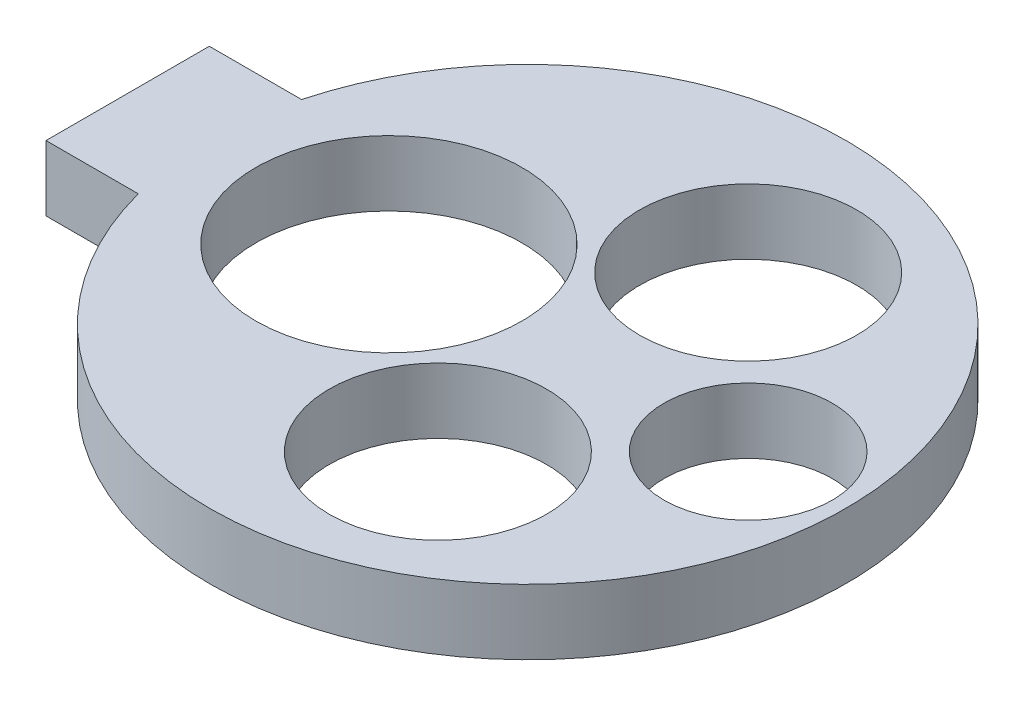
ISO-10303-21;
HEADER;
FILE_DESCRIPTION(('STEP AP214'),'2;1');
FILE_NAME('part.step','',(''),(''),'','','');
FILE_SCHEMA(('AUTOMOTIVE_DESIGN { 1 0 10303 214 1 1 1 1 }'));
ENDSEC;
DATA;
#1=APPLICATION_CONTEXT('core data for automotive mechanical design processes');
#2=APPLICATION_PROTOCOL_DEFINITION('international standard','automotive_design',2000,#1);
#3=PRODUCT_CONTEXT('',#1,'mechanical');
#4=PRODUCT('Part','Part','',(#3));
#5=PRODUCT_RELATED_PRODUCT_CATEGORY('part','',(#4));
#6=PRODUCT_DEFINITION_FORMATION('','',#4);
#7=PRODUCT_DEFINITION_CONTEXT('part definition',#1,'design');
#8=PRODUCT_DEFINITION('design','',#6,#7);
#9=PRODUCT_DEFINITION_SHAPE('','',#8);
#10=(LENGTH_UNIT() NAMED_UNIT(*) SI_UNIT(.MILLI.,.METRE.));
#11=(NAMED_UNIT(*) PLANE_ANGLE_UNIT() SI_UNIT($,.RADIAN.));
#12=(NAMED_UNIT(*) SI_UNIT($,.STERADIAN.) SOLID_ANGLE_UNIT());
#13=UNCERTAINTY_MEASURE_WITH_UNIT(LENGTH_MEASURE(1.E-05),#10,'distance_accuracy_value','');
#14=(GEOMETRIC_REPRESENTATION_CONTEXT(3) GLOBAL_UNCERTAINTY_ASSIGNED_CONTEXT((#13)) GLOBAL_UNIT_ASSIGNED_CONTEXT((#10,
#11,#12)) REPRESENTATION_CONTEXT('',''));
#15=CARTESIAN_POINT('',(0.,0.,0.));
#16=DIRECTION('',(0.,0.,1.));
#17=DIRECTION('',(1.,0.,0.));
#18=AXIS2_PLACEMENT_3D('',#15,#16,#17);
#19=CARTESIAN_POINT('',(0.,2.,0.));
#20=DIRECTION('',(0.,-1.,0.));
#21=DIRECTION('',(0.,0.,-1.));
#22=AXIS2_PLACEMENT_3D('',#19,#20,#21);
#23=CYLINDRICAL_SURFACE('',#22,19.5);
#24=DIRECTION('',(0.,-1.,0.));
#25=VECTOR('',#24,1.);
#26=CARTESIAN_POINT('',(-18.8480768249708,2.,5.));
#27=LINE('',#26,#25);
#28=CARTESIAN_POINT('',(-18.8480768249708,-2.,5.));
#29=VERTEX_POINT('',#28);
#30=CARTESIAN_POINT('',(-18.8480768249708,2.,5.));
#31=VERTEX_POINT('',#30);
#32=EDGE_CURVE('E11',#29,#31,#27,.F.);
#33=ORIENTED_EDGE('',*,*,#32,.F.);
#34=CARTESIAN_POINT('',(0.,-2.,0.));
#35=DIRECTION('',(0.,1.,0.));
#36=DIRECTION('',(0.,0.,1.));
#37=AXIS2_PLACEMENT_3D('',#34,#35,#36);
#38=CIRCLE('',#37,19.5);
#39=CARTESIAN_POINT('',(-18.8480768249708,-2.,-5.));
#40=VERTEX_POINT('',#39);
#41=EDGE_CURVE('E47',#29,#40,#38,.T.);
#42=ORIENTED_EDGE('',*,*,#41,.T.);
#43=DIRECTION('',(0.,-1.,0.));
#44=VECTOR('',#43,1.);
#45=CARTESIAN_POINT('',(-18.8480768249708,2.,-5.));
#46=LINE('',#45,#44);
#47=CARTESIAN_POINT('',(-18.8480768249708,2.,-5.));
#48=VERTEX_POINT('',#47);
#49=EDGE_CURVE('E40',#48,#40,#46,.T.);
#50=ORIENTED_EDGE('',*,*,#49,.F.);
#51=CARTESIAN_POINT('',(0.,2.,0.));
#52=DIRECTION('',(0.,1.,0.));
#53=DIRECTION('',(0.,0.,1.));
#54=AXIS2_PLACEMENT_3D('',#51,#52,#53);
#55=CIRCLE('',#54,19.5);
#56=EDGE_CURVE('E52',#31,#48,#55,.T.);
#57=ORIENTED_EDGE('',*,*,#56,.F.);
#58=EDGE_LOOP('',(#33,#42,#50,#57));
#59=FACE_BOUND('',#58,.T.);
#60=ADVANCED_FACE('F33',(#59),#23,.T.);
#61=CARTESIAN_POINT('',(0.,2.,0.));
#62=DIRECTION('',(0.,1.,0.));
#63=DIRECTION('',(0.,0.,1.));
#64=AXIS2_PLACEMENT_3D('',#61,#62,#63);
#65=PLANE('',#64);
#66=DIRECTION('',(1.,0.,0.));
#67=VECTOR('',#66,1.);
#68=CARTESIAN_POINT('',(-24.5,2.,5.));
#69=LINE('',#68,#67);
#70=CARTESIAN_POINT('',(-24.5,2.,5.));
#71=VERTEX_POINT('',#70);
#72=EDGE_CURVE('E71',#71,#31,#69,.T.);
#73=ORIENTED_EDGE('',*,*,#72,.T.);
#74=ORIENTED_EDGE('',*,*,#56,.T.);
#75=DIRECTION('',(-1.,0.,0.));
#76=VECTOR('',#75,1.);
#77=CARTESIAN_POINT('',(-17.5,2.,-5.));
#78=LINE('',#77,#76);
#79=CARTESIAN_POINT('',(-24.5,2.,-5.));
#80=VERTEX_POINT('',#79);
#81=EDGE_CURVE('E79',#48,#80,#78,.T.);
#82=ORIENTED_EDGE('',*,*,#81,.T.);
#83=DIRECTION('',(0.,0.,1.));
#84=VECTOR('',#83,1.);
#85=CARTESIAN_POINT('',(-24.5,2.,-5.));
#86=LINE('',#85,#84);
#87=EDGE_CURVE('E80',#80,#71,#86,.T.);
#88=ORIENTED_EDGE('',*,*,#87,.T.);
#89=EDGE_LOOP('',(#73,#74,#82,#88));
#90=FACE_BOUND('',#89,.T.);
#91=CARTESIAN_POINT('',(4.,2.,-9.5));
#92=DIRECTION('',(0.,1.,0.));
#93=DIRECTION('',(0.,0.,1.));
#94=AXIS2_PLACEMENT_3D('',#91,#92,#93);
#95=CIRCLE('',#94,6.65);
#96=CARTESIAN_POINT('',(4.,2.,-2.85));
#97=VERTEX_POINT('',#96);
#98=EDGE_CURVE('E106',#97,#97,#95,.T.);
#99=ORIENTED_EDGE('',*,*,#98,.F.);
#100=EDGE_LOOP('',(#99));
#101=FACE_BOUND('',#100,.T.);
#102=CARTESIAN_POINT('',(-8.5,2.,0.));
#103=DIRECTION('',(0.,1.,0.));
#104=DIRECTION('',(0.,0.,1.));
#105=AXIS2_PLACEMENT_3D('',#102,#103,#104);
#106=CIRCLE('',#105,8.15);
#107=CARTESIAN_POINT('',(-8.5,2.,8.15));
#108=VERTEX_POINT('',#107);
#109=EDGE_CURVE('E118',#108,#108,#106,.T.);
#110=ORIENTED_EDGE('',*,*,#109,.F.);
#111=EDGE_LOOP('',(#110));
#112=FACE_BOUND('',#111,.T.);
#113=CARTESIAN_POINT('',(4.,2.,9.5));
#114=DIRECTION('',(0.,1.,0.));
#115=DIRECTION('',(0.,0.,1.));
#116=AXIS2_PLACEMENT_3D('',#113,#114,#115);
#117=CIRCLE('',#116,6.65);
#118=CARTESIAN_POINT('',(4.,2.,16.15));
#119=VERTEX_POINT('',#118);
#120=EDGE_CURVE('E112',#119,#119,#117,.T.);
#121=ORIENTED_EDGE('',*,*,#120,.F.);
#122=EDGE_LOOP('',(#121));
#123=FACE_BOUND('',#122,.T.);
#124=CARTESIAN_POINT('',(13.5,2.,0.));
#125=DIRECTION('',(0.,1.,0.));
#126=DIRECTION('',(0.,0.,1.));
#127=AXIS2_PLACEMENT_3D('',#124,#125,#126);
#128=CIRCLE('',#127,5.15);
#129=CARTESIAN_POINT('',(13.5,2.,5.15));
#130=VERTEX_POINT('',#129);
#131=EDGE_CURVE('E98',#130,#130,#128,.T.);
#132=ORIENTED_EDGE('',*,*,#131,.F.);
#133=EDGE_LOOP('',(#132));
#134=FACE_BOUND('',#133,.T.);
#135=ADVANCED_FACE('F83',(#90,#101,#112,#123,#134),#65,.T.);
#136=CARTESIAN_POINT('',(0.,-2.,0.));
#137=DIRECTION('',(0.,1.,0.));
#138=DIRECTION('',(0.,0.,1.));
#139=AXIS2_PLACEMENT_3D('',#136,#137,#138);
#140=PLANE('',#139);
#141=ORIENTED_EDGE('',*,*,#41,.F.);
#142=DIRECTION('',(1.,0.,0.));
#143=VECTOR('',#142,1.);
#144=CARTESIAN_POINT('',(-24.5,-2.,5.));
#145=LINE('',#144,#143);
#146=CARTESIAN_POINT('',(-24.5,-2.,5.));
#147=VERTEX_POINT('',#146);
#148=EDGE_CURVE('E130',#147,#29,#145,.T.);
#149=ORIENTED_EDGE('',*,*,#148,.F.);
#150=DIRECTION('',(0.,0.,1.));
#151=VECTOR('',#150,1.);
#152=CARTESIAN_POINT('',(-24.5,-2.,-5.));
#153=LINE('',#152,#151);
#154=CARTESIAN_POINT('',(-24.5,-2.,-5.));
#155=VERTEX_POINT('',#154);
#156=EDGE_CURVE('E93',#155,#147,#153,.T.);
#157=ORIENTED_EDGE('',*,*,#156,.F.);
#158=DIRECTION('',(-1.,0.,0.));
#159=VECTOR('',#158,1.);
#160=CARTESIAN_POINT('',(-17.5,-2.,-5.));
#161=LINE('',#160,#159);
#162=EDGE_CURVE('E89',#40,#155,#161,.T.);
#163=ORIENTED_EDGE('',*,*,#162,.F.);
#164=EDGE_LOOP('',(#141,#149,#157,#163));
#165=FACE_BOUND('',#164,.T.);
#166=CARTESIAN_POINT('',(13.5,-2.,0.));
#167=DIRECTION('',(0.,1.,0.));
#168=DIRECTION('',(0.,0.,1.));
#169=AXIS2_PLACEMENT_3D('',#166,#167,#168);
#170=CIRCLE('',#169,5.15);
#171=CARTESIAN_POINT('',(13.5,-2.,5.15));
#172=VERTEX_POINT('',#171);
#173=EDGE_CURVE('E94',#172,#172,#170,.T.);
#174=ORIENTED_EDGE('',*,*,#173,.T.);
#175=EDGE_LOOP('',(#174));
#176=FACE_BOUND('',#175,.T.);
#177=CARTESIAN_POINT('',(4.,-2.,-9.5));
#178=DIRECTION('',(0.,1.,0.));
#179=DIRECTION('',(0.,0.,1.));
#180=AXIS2_PLACEMENT_3D('',#177,#178,#179);
#181=CIRCLE('',#180,6.65);
#182=CARTESIAN_POINT('',(4.,-2.,-2.85));
#183=VERTEX_POINT('',#182);
#184=EDGE_CURVE('E104',#183,#183,#181,.T.);
#185=ORIENTED_EDGE('',*,*,#184,.T.);
#186=EDGE_LOOP('',(#185));
#187=FACE_BOUND('',#186,.T.);
#188=CARTESIAN_POINT('',(4.,-2.,9.5));
#189=DIRECTION('',(0.,1.,0.));
#190=DIRECTION('',(0.,0.,1.));
#191=AXIS2_PLACEMENT_3D('',#188,#189,#190);
#192=CIRCLE('',#191,6.65);
#193=CARTESIAN_POINT('',(4.,-2.,16.15));
#194=VERTEX_POINT('',#193);
#195=EDGE_CURVE('E109',#194,#194,#192,.T.);
#196=ORIENTED_EDGE('',*,*,#195,.T.);
#197=EDGE_LOOP('',(#196));
#198=FACE_BOUND('',#197,.T.);
#199=CARTESIAN_POINT('',(-8.5,-2.,0.));
#200=DIRECTION('',(0.,1.,0.));
#201=DIRECTION('',(0.,0.,1.));
#202=AXIS2_PLACEMENT_3D('',#199,#200,#201);
#203=CIRCLE('',#202,8.15);
#204=CARTESIAN_POINT('',(-8.5,-2.,8.15));
#205=VERTEX_POINT('',#204);
#206=EDGE_CURVE('E115',#205,#205,#203,.T.);
#207=ORIENTED_EDGE('',*,*,#206,.T.);
#208=EDGE_LOOP('',(#207));
#209=FACE_BOUND('',#208,.T.);
#210=ADVANCED_FACE('F128',(#165,#176,#187,#198,#209),#140,.F.);
#211=CARTESIAN_POINT('',(-8.5,2.,0.));
#212=DIRECTION('',(0.,-1.,0.));
#213=DIRECTION('',(0.,0.,-1.));
#214=AXIS2_PLACEMENT_3D('',#211,#212,#213);
#215=CYLINDRICAL_SURFACE('',#214,8.15);
#216=ORIENTED_EDGE('',*,*,#109,.T.);
#217=EDGE_LOOP('',(#216));
#218=FACE_BOUND('',#217,.T.);
#219=ORIENTED_EDGE('',*,*,#206,.F.);
#220=EDGE_LOOP('',(#219));
#221=FACE_BOUND('',#220,.T.);
#222=ADVANCED_FACE('F142',(#218,#221),#215,.F.);
#223=CARTESIAN_POINT('',(4.,2.,9.5));
#224=DIRECTION('',(0.,-1.,0.));
#225=DIRECTION('',(0.,0.,-1.));
#226=AXIS2_PLACEMENT_3D('',#223,#224,#225);
#227=CYLINDRICAL_SURFACE('',#226,6.65);
#228=ORIENTED_EDGE('',*,*,#120,.T.);
#229=EDGE_LOOP('',(#228));
#230=FACE_BOUND('',#229,.T.);
#231=ORIENTED_EDGE('',*,*,#195,.F.);
#232=EDGE_LOOP('',(#231));
#233=FACE_BOUND('',#232,.T.);
#234=ADVANCED_FACE('F146',(#230,#233),#227,.F.);
#235=CARTESIAN_POINT('',(4.,2.,-9.5));
#236=DIRECTION('',(0.,-1.,0.));
#237=DIRECTION('',(0.,0.,-1.));
#238=AXIS2_PLACEMENT_3D('',#235,#236,#237);
#239=CYLINDRICAL_SURFACE('',#238,6.65);
#240=ORIENTED_EDGE('',*,*,#98,.T.);
#241=EDGE_LOOP('',(#240));
#242=FACE_BOUND('',#241,.T.);
#243=ORIENTED_EDGE('',*,*,#184,.F.);
#244=EDGE_LOOP('',(#243));
#245=FACE_BOUND('',#244,.T.);
#246=ADVANCED_FACE('F150',(#242,#245),#239,.F.);
#247=CARTESIAN_POINT('',(13.5,2.,0.));
#248=DIRECTION('',(0.,-1.,0.));
#249=DIRECTION('',(0.,0.,-1.));
#250=AXIS2_PLACEMENT_3D('',#247,#248,#249);
#251=CYLINDRICAL_SURFACE('',#250,5.15);
#252=ORIENTED_EDGE('',*,*,#131,.T.);
#253=EDGE_LOOP('',(#252));
#254=FACE_BOUND('',#253,.T.);
#255=ORIENTED_EDGE('',*,*,#173,.F.);
#256=EDGE_LOOP('',(#255));
#257=FACE_BOUND('',#256,.T.);
#258=ADVANCED_FACE('F154',(#254,#257),#251,.F.);
#259=CARTESIAN_POINT('',(-24.5,2.,5.));
#260=DIRECTION('',(0.,0.,-1.));
#261=DIRECTION('',(-1.,0.,0.));
#262=AXIS2_PLACEMENT_3D('',#259,#260,#261);
#263=PLANE('',#262);
#264=ORIENTED_EDGE('',*,*,#148,.T.);
#265=ORIENTED_EDGE('',*,*,#32,.T.);
#266=ORIENTED_EDGE('',*,*,#72,.F.);
#267=DIRECTION('',(0.,-1.,0.));
#268=VECTOR('',#267,1.);
#269=CARTESIAN_POINT('',(-24.5,2.,5.));
#270=LINE('',#269,#268);
#271=EDGE_CURVE('E76',#71,#147,#270,.T.);
#272=ORIENTED_EDGE('',*,*,#271,.T.);
#273=EDGE_LOOP('',(#264,#265,#266,#272));
#274=FACE_BOUND('',#273,.T.);
#275=ADVANCED_FACE('F74',(#274),#263,.F.);
#276=CARTESIAN_POINT('',(-17.5,2.,-5.));
#277=DIRECTION('',(0.,0.,1.));
#278=DIRECTION('',(1.,0.,0.));
#279=AXIS2_PLACEMENT_3D('',#276,#277,#278);
#280=PLANE('',#279);
#281=ORIENTED_EDGE('',*,*,#81,.F.);
#282=ORIENTED_EDGE('',*,*,#49,.T.);
#283=ORIENTED_EDGE('',*,*,#162,.T.);
#284=DIRECTION('',(0.,-1.,0.));
#285=VECTOR('',#284,1.);
#286=CARTESIAN_POINT('',(-24.5,2.,-5.));
#287=LINE('',#286,#285);
#288=EDGE_CURVE('E95',#80,#155,#287,.T.);
#289=ORIENTED_EDGE('',*,*,#288,.F.);
#290=EDGE_LOOP('',(#281,#282,#283,#289));
#291=FACE_BOUND('',#290,.T.);
#292=ADVANCED_FACE('F126',(#291),#280,.F.);
#293=CARTESIAN_POINT('',(-24.5,2.,-5.));
#294=DIRECTION('',(1.,0.,0.));
#295=DIRECTION('',(0.,0.,-1.));
#296=AXIS2_PLACEMENT_3D('',#293,#294,#295);
#297=PLANE('',#296);
#298=ORIENTED_EDGE('',*,*,#156,.T.);
#299=ORIENTED_EDGE('',*,*,#271,.F.);
#300=ORIENTED_EDGE('',*,*,#87,.F.);
#301=ORIENTED_EDGE('',*,*,#288,.T.);
#302=EDGE_LOOP('',(#298,#299,#300,#301));
#303=FACE_BOUND('',#302,.T.);
#304=ADVANCED_FACE('F91',(#303),#297,.F.);
#305=CLOSED_SHELL('',(#60,#135,#210,#222,#234,#246,#258,#275,#292,#304));
#306=MANIFOLD_SOLID_BREP('B2',#305);
#307=ADVANCED_BREP_SHAPE_REPRESENTATION('',(#18,#306),#14);
#308=SHAPE_DEFINITION_REPRESENTATION(#9,#307);
ENDSEC;
END-ISO-10303-21;
